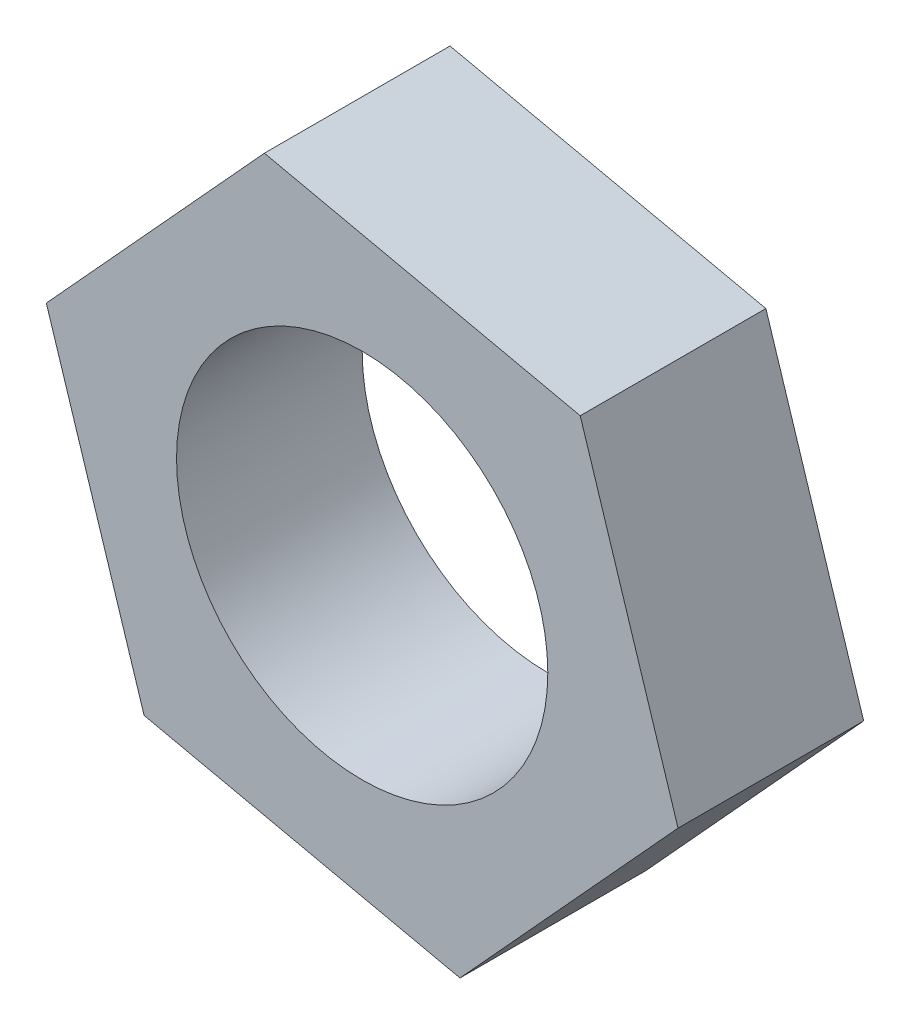
ISO-10303-21;
HEADER;
FILE_DESCRIPTION(('STEP AP214'),'2;1');
FILE_NAME('part.step','',(''),(''),'','','');
FILE_SCHEMA(('AUTOMOTIVE_DESIGN { 1 0 10303 214 1 1 1 1 }'));
ENDSEC;
DATA;
#1=APPLICATION_CONTEXT('core data for automotive mechanical design processes');
#2=APPLICATION_PROTOCOL_DEFINITION('international standard','automotive_design',2000,#1);
#3=PRODUCT_CONTEXT('',#1,'mechanical');
#4=PRODUCT('Part','Part','',(#3));
#5=PRODUCT_RELATED_PRODUCT_CATEGORY('part','',(#4));
#6=PRODUCT_DEFINITION_FORMATION('','',#4);
#7=PRODUCT_DEFINITION_CONTEXT('part definition',#1,'design');
#8=PRODUCT_DEFINITION('design','',#6,#7);
#9=PRODUCT_DEFINITION_SHAPE('','',#8);
#10=(LENGTH_UNIT() NAMED_UNIT(*) SI_UNIT(.MILLI.,.METRE.));
#11=(NAMED_UNIT(*) PLANE_ANGLE_UNIT() SI_UNIT($,.RADIAN.));
#12=(NAMED_UNIT(*) SI_UNIT($,.STERADIAN.) SOLID_ANGLE_UNIT());
#13=UNCERTAINTY_MEASURE_WITH_UNIT(LENGTH_MEASURE(1.E-05),#10,'distance_accuracy_value','');
#14=(GEOMETRIC_REPRESENTATION_CONTEXT(3) GLOBAL_UNCERTAINTY_ASSIGNED_CONTEXT((#13)) GLOBAL_UNIT_ASSIGNED_CONTEXT((#10,
#11,#12)) REPRESENTATION_CONTEXT('',''));
#15=CARTESIAN_POINT('',(0.,0.,0.));
#16=DIRECTION('',(0.,0.,1.));
#17=DIRECTION('',(1.,0.,0.));
#18=AXIS2_PLACEMENT_3D('',#15,#16,#17);
#19=CARTESIAN_POINT('',(0.,0.,1.));
#20=DIRECTION('',(0.,0.,1.));
#21=DIRECTION('',(1.,0.,0.));
#22=AXIS2_PLACEMENT_3D('',#19,#20,#21);
#23=PLANE('',#22);
#24=DIRECTION('',(-0.976676705702205,0.214715189352519,0.));
#25=VECTOR('',#24,1.);
#26=CARTESIAN_POINT('',(1.17467040688897,1.28648151214114,1.));
#27=LINE('',#26,#25);
#28=CARTESIAN_POINT('',(1.17467040688897,1.28648151214114,1.));
#29=VERTEX_POINT('',#28);
#30=CARTESIAN_POINT('',(-0.526790467568761,1.66053516951022,1.));
#31=VERTEX_POINT('',#30);
#32=EDGE_CURVE('E131',#29,#31,#27,.T.);
#33=ORIENTED_EDGE('',*,*,#32,.T.);
#34=DIRECTION('',(-0.67428716140877,-0.738469243746348,0.));
#35=VECTOR('',#34,1.);
#36=CARTESIAN_POINT('',(-0.526790467568761,1.66053516951022,1.));
#37=LINE('',#36,#35);
#38=CARTESIAN_POINT('',(-1.70146087445773,0.37405365736908,1.));
#39=VERTEX_POINT('',#38);
#40=EDGE_CURVE('E89',#31,#39,#37,.T.);
#41=ORIENTED_EDGE('',*,*,#40,.T.);
#42=DIRECTION('',(0.302389544293435,-0.953184433098867,0.));
#43=VECTOR('',#42,1.);
#44=CARTESIAN_POINT('',(-1.70146087445773,0.37405365736908,1.));
#45=LINE('',#44,#43);
#46=CARTESIAN_POINT('',(-1.17467040688897,-1.28648151214114,1.));
#47=VERTEX_POINT('',#46);
#48=EDGE_CURVE('E102',#39,#47,#45,.T.);
#49=ORIENTED_EDGE('',*,*,#48,.T.);
#50=DIRECTION('',(0.976676705702205,-0.21471518935252,0.));
#51=VECTOR('',#50,1.);
#52=CARTESIAN_POINT('',(-1.17467040688897,-1.28648151214114,1.));
#53=LINE('',#52,#51);
#54=CARTESIAN_POINT('',(0.526790467568759,-1.66053516951022,1.));
#55=VERTEX_POINT('',#54);
#56=EDGE_CURVE('E96',#47,#55,#53,.T.);
#57=ORIENTED_EDGE('',*,*,#56,.T.);
#58=DIRECTION('',(0.67428716140877,0.738469243746348,0.));
#59=VECTOR('',#58,1.);
#60=CARTESIAN_POINT('',(0.526790467568759,-1.66053516951022,1.));
#61=LINE('',#60,#59);
#62=CARTESIAN_POINT('',(1.70146087445773,-0.374053657369078,1.));
#63=VERTEX_POINT('',#62);
#64=EDGE_CURVE('E100',#55,#63,#61,.T.);
#65=ORIENTED_EDGE('',*,*,#64,.T.);
#66=DIRECTION('',(-0.302389544293435,0.953184433098867,0.));
#67=VECTOR('',#66,1.);
#68=CARTESIAN_POINT('',(1.70146087445773,-0.374053657369078,1.));
#69=LINE('',#68,#67);
#70=EDGE_CURVE('E52',#63,#29,#69,.T.);
#71=ORIENTED_EDGE('',*,*,#70,.T.);
#72=EDGE_LOOP('',(#33,#41,#49,#57,#65,#71));
#73=FACE_BOUND('',#72,.T.);
#74=CARTESIAN_POINT('',(0.,0.,1.));
#75=DIRECTION('',(0.,0.,1.));
#76=DIRECTION('',(1.,0.,0.));
#77=AXIS2_PLACEMENT_3D('',#74,#75,#76);
#78=CIRCLE('',#77,1.);
#79=CARTESIAN_POINT('',(1.,0.,1.));
#80=VERTEX_POINT('',#79);
#81=EDGE_CURVE('E124',#80,#80,#78,.T.);
#82=ORIENTED_EDGE('',*,*,#81,.F.);
#83=EDGE_LOOP('',(#82));
#84=FACE_BOUND('',#83,.T.);
#85=ADVANCED_FACE('F35',(#73,#84),#23,.T.);
#86=CARTESIAN_POINT('',(0.,0.,0.));
#87=DIRECTION('',(0.,0.,1.));
#88=DIRECTION('',(1.,0.,0.));
#89=AXIS2_PLACEMENT_3D('',#86,#87,#88);
#90=PLANE('',#89);
#91=DIRECTION('',(-0.976676705702205,0.214715189352519,0.));
#92=VECTOR('',#91,1.);
#93=CARTESIAN_POINT('',(1.17467040688897,1.28648151214114,0.));
#94=LINE('',#93,#92);
#95=CARTESIAN_POINT('',(1.17467040688897,1.28648151214114,0.));
#96=VERTEX_POINT('',#95);
#97=CARTESIAN_POINT('',(-0.526790467568761,1.66053516951022,0.));
#98=VERTEX_POINT('',#97);
#99=EDGE_CURVE('E120',#96,#98,#94,.T.);
#100=ORIENTED_EDGE('',*,*,#99,.F.);
#101=DIRECTION('',(-0.302389544293435,0.953184433098867,0.));
#102=VECTOR('',#101,1.);
#103=CARTESIAN_POINT('',(1.70146087445773,-0.374053657369078,0.));
#104=LINE('',#103,#102);
#105=CARTESIAN_POINT('',(1.70146087445773,-0.374053657369078,0.));
#106=VERTEX_POINT('',#105);
#107=EDGE_CURVE('E81',#106,#96,#104,.T.);
#108=ORIENTED_EDGE('',*,*,#107,.F.);
#109=DIRECTION('',(0.67428716140877,0.738469243746348,0.));
#110=VECTOR('',#109,1.);
#111=CARTESIAN_POINT('',(0.526790467568759,-1.66053516951022,0.));
#112=LINE('',#111,#110);
#113=CARTESIAN_POINT('',(0.526790467568759,-1.66053516951022,0.));
#114=VERTEX_POINT('',#113);
#115=EDGE_CURVE('E75',#114,#106,#112,.T.);
#116=ORIENTED_EDGE('',*,*,#115,.F.);
#117=DIRECTION('',(0.976676705702205,-0.21471518935252,0.));
#118=VECTOR('',#117,1.);
#119=CARTESIAN_POINT('',(-1.17467040688897,-1.28648151214114,0.));
#120=LINE('',#119,#118);
#121=CARTESIAN_POINT('',(-1.17467040688897,-1.28648151214114,0.));
#122=VERTEX_POINT('',#121);
#123=EDGE_CURVE('E110',#122,#114,#120,.T.);
#124=ORIENTED_EDGE('',*,*,#123,.F.);
#125=DIRECTION('',(0.302389544293435,-0.953184433098867,0.));
#126=VECTOR('',#125,1.);
#127=CARTESIAN_POINT('',(-1.70146087445773,0.37405365736908,0.));
#128=LINE('',#127,#126);
#129=CARTESIAN_POINT('',(-1.70146087445773,0.37405365736908,0.));
#130=VERTEX_POINT('',#129);
#131=EDGE_CURVE('E126',#130,#122,#128,.T.);
#132=ORIENTED_EDGE('',*,*,#131,.F.);
#133=DIRECTION('',(-0.67428716140877,-0.738469243746348,0.));
#134=VECTOR('',#133,1.);
#135=CARTESIAN_POINT('',(-0.526790467568761,1.66053516951022,0.));
#136=LINE('',#135,#134);
#137=EDGE_CURVE('E123',#98,#130,#136,.T.);
#138=ORIENTED_EDGE('',*,*,#137,.F.);
#139=EDGE_LOOP('',(#100,#108,#116,#124,#132,#138));
#140=FACE_BOUND('',#139,.T.);
#141=CARTESIAN_POINT('',(0.,0.,0.));
#142=DIRECTION('',(0.,0.,1.));
#143=DIRECTION('',(1.,0.,0.));
#144=AXIS2_PLACEMENT_3D('',#141,#142,#143);
#145=CIRCLE('',#144,1.);
#146=CARTESIAN_POINT('',(1.,0.,0.));
#147=VERTEX_POINT('',#146);
#148=EDGE_CURVE('E224',#147,#147,#145,.T.);
#149=ORIENTED_EDGE('',*,*,#148,.T.);
#150=EDGE_LOOP('',(#149));
#151=FACE_BOUND('',#150,.T.);
#152=ADVANCED_FACE('F140',(#140,#151),#90,.F.);
#153=CARTESIAN_POINT('',(1.17467040688897,1.28648151214114,1.));
#154=DIRECTION('',(-0.214715189352519,-0.976676705702205,0.));
#155=DIRECTION('',(0.976676705702205,-0.214715189352519,0.));
#156=AXIS2_PLACEMENT_3D('',#153,#154,#155);
#157=PLANE('',#156);
#158=ORIENTED_EDGE('',*,*,#99,.T.);
#159=DIRECTION('',(0.,0.,-1.));
#160=VECTOR('',#159,1.);
#161=CARTESIAN_POINT('',(-0.526790467568761,1.66053516951022,1.));
#162=LINE('',#161,#160);
#163=EDGE_CURVE('E11',#31,#98,#162,.T.);
#164=ORIENTED_EDGE('',*,*,#163,.F.);
#165=ORIENTED_EDGE('',*,*,#32,.F.);
#166=DIRECTION('',(0.,0.,-1.));
#167=VECTOR('',#166,1.);
#168=CARTESIAN_POINT('',(1.17467040688897,1.28648151214114,1.));
#169=LINE('',#168,#167);
#170=EDGE_CURVE('E116',#29,#96,#169,.T.);
#171=ORIENTED_EDGE('',*,*,#170,.T.);
#172=EDGE_LOOP('',(#158,#164,#165,#171));
#173=FACE_BOUND('',#172,.T.);
#174=ADVANCED_FACE('F37',(#173),#157,.F.);
#175=CARTESIAN_POINT('',(-0.526790467568761,1.66053516951022,1.));
#176=DIRECTION('',(0.738469243746348,-0.67428716140877,0.));
#177=DIRECTION('',(0.67428716140877,0.738469243746348,0.));
#178=AXIS2_PLACEMENT_3D('',#175,#176,#177);
#179=PLANE('',#178);
#180=ORIENTED_EDGE('',*,*,#137,.T.);
#181=DIRECTION('',(0.,0.,-1.));
#182=VECTOR('',#181,1.);
#183=CARTESIAN_POINT('',(-1.70146087445773,0.37405365736908,1.));
#184=LINE('',#183,#182);
#185=EDGE_CURVE('E44',#39,#130,#184,.T.);
#186=ORIENTED_EDGE('',*,*,#185,.F.);
#187=ORIENTED_EDGE('',*,*,#40,.F.);
#188=ORIENTED_EDGE('',*,*,#163,.T.);
#189=EDGE_LOOP('',(#180,#186,#187,#188));
#190=FACE_BOUND('',#189,.T.);
#191=ADVANCED_FACE('F165',(#190),#179,.F.);
#192=CARTESIAN_POINT('',(-1.70146087445773,0.37405365736908,1.));
#193=DIRECTION('',(0.953184433098867,0.302389544293435,0.));
#194=DIRECTION('',(-0.302389544293435,0.953184433098867,0.));
#195=AXIS2_PLACEMENT_3D('',#192,#193,#194);
#196=PLANE('',#195);
#197=ORIENTED_EDGE('',*,*,#131,.T.);
#198=DIRECTION('',(0.,0.,-1.));
#199=VECTOR('',#198,1.);
#200=CARTESIAN_POINT('',(-1.17467040688897,-1.28648151214114,1.));
#201=LINE('',#200,#199);
#202=EDGE_CURVE('E111',#47,#122,#201,.T.);
#203=ORIENTED_EDGE('',*,*,#202,.F.);
#204=ORIENTED_EDGE('',*,*,#48,.F.);
#205=ORIENTED_EDGE('',*,*,#185,.T.);
#206=EDGE_LOOP('',(#197,#203,#204,#205));
#207=FACE_BOUND('',#206,.T.);
#208=ADVANCED_FACE('F137',(#207),#196,.F.);
#209=CARTESIAN_POINT('',(-1.17467040688897,-1.28648151214114,1.));
#210=DIRECTION('',(0.21471518935252,0.976676705702205,0.));
#211=DIRECTION('',(-0.976676705702205,0.21471518935252,0.));
#212=AXIS2_PLACEMENT_3D('',#209,#210,#211);
#213=PLANE('',#212);
#214=ORIENTED_EDGE('',*,*,#123,.T.);
#215=DIRECTION('',(0.,0.,-1.));
#216=VECTOR('',#215,1.);
#217=CARTESIAN_POINT('',(0.526790467568759,-1.66053516951022,1.));
#218=LINE('',#217,#216);
#219=EDGE_CURVE('E107',#55,#114,#218,.T.);
#220=ORIENTED_EDGE('',*,*,#219,.F.);
#221=ORIENTED_EDGE('',*,*,#56,.F.);
#222=ORIENTED_EDGE('',*,*,#202,.T.);
#223=EDGE_LOOP('',(#214,#220,#221,#222));
#224=FACE_BOUND('',#223,.T.);
#225=ADVANCED_FACE('F108',(#224),#213,.F.);
#226=CARTESIAN_POINT('',(0.526790467568759,-1.66053516951022,1.));
#227=DIRECTION('',(-0.738469243746348,0.67428716140877,0.));
#228=DIRECTION('',(-0.67428716140877,-0.738469243746348,0.));
#229=AXIS2_PLACEMENT_3D('',#226,#227,#228);
#230=PLANE('',#229);
#231=ORIENTED_EDGE('',*,*,#115,.T.);
#232=DIRECTION('',(0.,0.,-1.));
#233=VECTOR('',#232,1.);
#234=CARTESIAN_POINT('',(1.70146087445773,-0.374053657369078,1.));
#235=LINE('',#234,#233);
#236=EDGE_CURVE('E112',#63,#106,#235,.T.);
#237=ORIENTED_EDGE('',*,*,#236,.F.);
#238=ORIENTED_EDGE('',*,*,#64,.F.);
#239=ORIENTED_EDGE('',*,*,#219,.T.);
#240=EDGE_LOOP('',(#231,#237,#238,#239));
#241=FACE_BOUND('',#240,.T.);
#242=ADVANCED_FACE('F114',(#241),#230,.F.);
#243=CARTESIAN_POINT('',(1.70146087445773,-0.374053657369078,1.));
#244=DIRECTION('',(-0.953184433098867,-0.302389544293435,0.));
#245=DIRECTION('',(0.302389544293435,-0.953184433098867,0.));
#246=AXIS2_PLACEMENT_3D('',#243,#244,#245);
#247=PLANE('',#246);
#248=ORIENTED_EDGE('',*,*,#107,.T.);
#249=ORIENTED_EDGE('',*,*,#170,.F.);
#250=ORIENTED_EDGE('',*,*,#70,.F.);
#251=ORIENTED_EDGE('',*,*,#236,.T.);
#252=EDGE_LOOP('',(#248,#249,#250,#251));
#253=FACE_BOUND('',#252,.T.);
#254=ADVANCED_FACE('F145',(#253),#247,.F.);
#255=CARTESIAN_POINT('',(0.,0.,1.));
#256=DIRECTION('',(0.,0.,-1.));
#257=DIRECTION('',(-1.,0.,0.));
#258=AXIS2_PLACEMENT_3D('',#255,#256,#257);
#259=CYLINDRICAL_SURFACE('',#258,1.);
#260=ORIENTED_EDGE('',*,*,#81,.T.);
#261=EDGE_LOOP('',(#260));
#262=FACE_BOUND('',#261,.T.);
#263=ORIENTED_EDGE('',*,*,#148,.F.);
#264=EDGE_LOOP('',(#263));
#265=FACE_BOUND('',#264,.T.);
#266=ADVANCED_FACE('F147',(#262,#265),#259,.F.);
#267=CLOSED_SHELL('',(#85,#152,#174,#191,#208,#225,#242,#254,#266));
#268=MANIFOLD_SOLID_BREP('B2',#267);
#269=ADVANCED_BREP_SHAPE_REPRESENTATION('',(#18,#268),#14);
#270=SHAPE_DEFINITION_REPRESENTATION(#9,#269);
ENDSEC;
END-ISO-10303-21;
